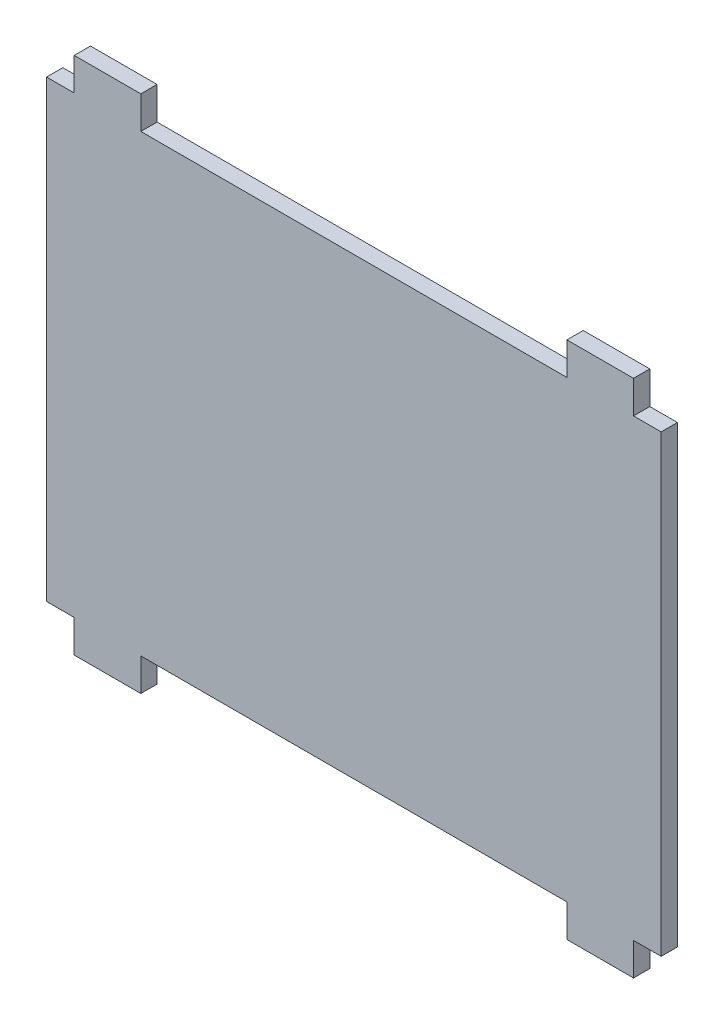
ISO-10303-21;
HEADER;
FILE_DESCRIPTION(('STEP AP214'),'2;1');
FILE_NAME('part.step','',(''),(''),'','','');
FILE_SCHEMA(('AUTOMOTIVE_DESIGN { 1 0 10303 214 1 1 1 1 }'));
ENDSEC;
DATA;
#1=APPLICATION_CONTEXT('core data for automotive mechanical design processes');
#2=APPLICATION_PROTOCOL_DEFINITION('international standard','automotive_design',2000,#1);
#3=PRODUCT_CONTEXT('',#1,'mechanical');
#4=PRODUCT('Part','Part','',(#3));
#5=PRODUCT_RELATED_PRODUCT_CATEGORY('part','',(#4));
#6=PRODUCT_DEFINITION_FORMATION('','',#4);
#7=PRODUCT_DEFINITION_CONTEXT('part definition',#1,'design');
#8=PRODUCT_DEFINITION('design','',#6,#7);
#9=PRODUCT_DEFINITION_SHAPE('','',#8);
#10=(LENGTH_UNIT() NAMED_UNIT(*) SI_UNIT(.MILLI.,.METRE.));
#11=(NAMED_UNIT(*) PLANE_ANGLE_UNIT() SI_UNIT($,.RADIAN.));
#12=(NAMED_UNIT(*) SI_UNIT($,.STERADIAN.) SOLID_ANGLE_UNIT());
#13=UNCERTAINTY_MEASURE_WITH_UNIT(LENGTH_MEASURE(1.E-05),#10,'distance_accuracy_value','');
#14=(GEOMETRIC_REPRESENTATION_CONTEXT(3) GLOBAL_UNCERTAINTY_ASSIGNED_CONTEXT((#13)) GLOBAL_UNIT_ASSIGNED_CONTEXT((#10,
#11,#12)) REPRESENTATION_CONTEXT('',''));
#15=CARTESIAN_POINT('',(0.,0.,0.));
#16=DIRECTION('',(0.,0.,1.));
#17=DIRECTION('',(1.,0.,0.));
#18=AXIS2_PLACEMENT_3D('',#15,#16,#17);
#19=CARTESIAN_POINT('',(-30.,0.,1.5875));
#20=DIRECTION('',(1.,0.,0.));
#21=DIRECTION('',(0.,0.,-1.));
#22=AXIS2_PLACEMENT_3D('',#19,#20,#21);
#23=PLANE('',#22);
#24=DIRECTION('',(0.,0.,-1.));
#25=VECTOR('',#24,1.);
#26=CARTESIAN_POINT('',(-30.,-22.17,1.5875));
#27=LINE('',#26,#25);
#28=CARTESIAN_POINT('',(-30.,-22.17,1.5875));
#29=VERTEX_POINT('',#28);
#30=CARTESIAN_POINT('',(-30.,-22.17,0.));
#31=VERTEX_POINT('',#30);
#32=EDGE_CURVE('E236',#29,#31,#27,.T.);
#33=ORIENTED_EDGE('',*,*,#32,.F.);
#34=DIRECTION('',(0.,-1.,0.));
#35=VECTOR('',#34,1.);
#36=CARTESIAN_POINT('',(-30.,0.,1.5875));
#37=LINE('',#36,#35);
#38=CARTESIAN_POINT('',(-30.,22.17,1.5875));
#39=VERTEX_POINT('',#38);
#40=EDGE_CURVE('E307',#39,#29,#37,.T.);
#41=ORIENTED_EDGE('',*,*,#40,.F.);
#42=DIRECTION('',(0.,0.,-1.));
#43=VECTOR('',#42,1.);
#44=CARTESIAN_POINT('',(-30.,22.17,1.5875));
#45=LINE('',#44,#43);
#46=CARTESIAN_POINT('',(-30.,22.17,0.));
#47=VERTEX_POINT('',#46);
#48=EDGE_CURVE('E303',#39,#47,#45,.T.);
#49=ORIENTED_EDGE('',*,*,#48,.T.);
#50=DIRECTION('',(0.,-1.,0.));
#51=VECTOR('',#50,1.);
#52=CARTESIAN_POINT('',(-30.,0.,0.));
#53=LINE('',#52,#51);
#54=EDGE_CURVE('E306',#47,#31,#53,.T.);
#55=ORIENTED_EDGE('',*,*,#54,.T.);
#56=EDGE_LOOP('',(#33,#41,#49,#55));
#57=FACE_BOUND('',#56,.T.);
#58=ADVANCED_FACE('F36',(#57),#23,.F.);
#59=CARTESIAN_POINT('',(30.,0.,1.5875));
#60=DIRECTION('',(-1.,0.,0.));
#61=DIRECTION('',(0.,0.,1.));
#62=AXIS2_PLACEMENT_3D('',#59,#60,#61);
#63=PLANE('',#62);
#64=DIRECTION('',(0.,0.,1.));
#65=VECTOR('',#64,1.);
#66=CARTESIAN_POINT('',(30.,-22.17,1.5875));
#67=LINE('',#66,#65);
#68=CARTESIAN_POINT('',(30.,-22.17,0.));
#69=VERTEX_POINT('',#68);
#70=CARTESIAN_POINT('',(30.,-22.17,1.5875));
#71=VERTEX_POINT('',#70);
#72=EDGE_CURVE('E229',#69,#71,#67,.T.);
#73=ORIENTED_EDGE('',*,*,#72,.F.);
#74=DIRECTION('',(0.,1.,0.));
#75=VECTOR('',#74,1.);
#76=CARTESIAN_POINT('',(30.,0.,0.));
#77=LINE('',#76,#75);
#78=CARTESIAN_POINT('',(30.,22.17,0.));
#79=VERTEX_POINT('',#78);
#80=EDGE_CURVE('E191',#69,#79,#77,.T.);
#81=ORIENTED_EDGE('',*,*,#80,.T.);
#82=DIRECTION('',(0.,0.,1.));
#83=VECTOR('',#82,1.);
#84=CARTESIAN_POINT('',(30.,22.17,1.5875));
#85=LINE('',#84,#83);
#86=CARTESIAN_POINT('',(30.,22.17,1.5875));
#87=VERTEX_POINT('',#86);
#88=EDGE_CURVE('E294',#79,#87,#85,.T.);
#89=ORIENTED_EDGE('',*,*,#88,.T.);
#90=DIRECTION('',(0.,1.,0.));
#91=VECTOR('',#90,1.);
#92=CARTESIAN_POINT('',(30.,0.,1.5875));
#93=LINE('',#92,#91);
#94=EDGE_CURVE('E310',#71,#87,#93,.T.);
#95=ORIENTED_EDGE('',*,*,#94,.F.);
#96=EDGE_LOOP('',(#73,#81,#89,#95));
#97=FACE_BOUND('',#96,.T.);
#98=ADVANCED_FACE('F349',(#97),#63,.F.);
#99=CARTESIAN_POINT('',(0.,0.,1.5875));
#100=DIRECTION('',(0.,0.,-1.));
#101=DIRECTION('',(-1.,0.,0.));
#102=AXIS2_PLACEMENT_3D('',#99,#100,#101);
#103=PLANE('',#102);
#104=DIRECTION('',(1.,0.,0.));
#105=VECTOR('',#104,1.);
#106=CARTESIAN_POINT('',(-32.7,-22.17,1.5875));
#107=LINE('',#106,#105);
#108=CARTESIAN_POINT('',(-27.3,-22.17,1.5875));
#109=VERTEX_POINT('',#108);
#110=EDGE_CURVE('E205',#29,#109,#107,.T.);
#111=ORIENTED_EDGE('',*,*,#110,.T.);
#112=DIRECTION('',(0.,-1.,0.));
#113=VECTOR('',#112,1.);
#114=CARTESIAN_POINT('',(-27.3,-25.35,1.5875));
#115=LINE('',#114,#113);
#116=CARTESIAN_POINT('',(-27.3,-25.35,1.5875));
#117=VERTEX_POINT('',#116);
#118=EDGE_CURVE('E202',#109,#117,#115,.T.);
#119=ORIENTED_EDGE('',*,*,#118,.T.);
#120=DIRECTION('',(-1.,0.,0.));
#121=VECTOR('',#120,1.);
#122=CARTESIAN_POINT('',(-30.,-25.35,1.5875));
#123=LINE('',#122,#121);
#124=CARTESIAN_POINT('',(-20.8,-25.35,1.5875));
#125=VERTEX_POINT('',#124);
#126=EDGE_CURVE('E239',#125,#117,#123,.T.);
#127=ORIENTED_EDGE('',*,*,#126,.F.);
#128=DIRECTION('',(0.,1.,0.));
#129=VECTOR('',#128,1.);
#130=CARTESIAN_POINT('',(-20.8,-25.35,1.5875));
#131=LINE('',#130,#129);
#132=CARTESIAN_POINT('',(-20.8,-22.17,1.5875));
#133=VERTEX_POINT('',#132);
#134=EDGE_CURVE('E50',#125,#133,#131,.T.);
#135=ORIENTED_EDGE('',*,*,#134,.T.);
#136=DIRECTION('',(1.,0.,0.));
#137=VECTOR('',#136,1.);
#138=CARTESIAN_POINT('',(-20.8,-22.17,1.5875));
#139=LINE('',#138,#137);
#140=CARTESIAN_POINT('',(20.8,-22.17,1.5875));
#141=VERTEX_POINT('',#140);
#142=EDGE_CURVE('E197',#133,#141,#139,.T.);
#143=ORIENTED_EDGE('',*,*,#142,.T.);
#144=DIRECTION('',(0.,-1.,0.));
#145=VECTOR('',#144,1.);
#146=CARTESIAN_POINT('',(20.8,-25.35,1.5875));
#147=LINE('',#146,#145);
#148=CARTESIAN_POINT('',(20.8,-25.35,1.5875));
#149=VERTEX_POINT('',#148);
#150=EDGE_CURVE('E216',#141,#149,#147,.T.);
#151=ORIENTED_EDGE('',*,*,#150,.T.);
#152=CARTESIAN_POINT('',(27.3,-25.35,1.5875));
#153=VERTEX_POINT('',#152);
#154=EDGE_CURVE('E242',#153,#149,#123,.T.);
#155=ORIENTED_EDGE('',*,*,#154,.F.);
#156=DIRECTION('',(0.,1.,0.));
#157=VECTOR('',#156,1.);
#158=CARTESIAN_POINT('',(27.3,-25.35,1.5875));
#159=LINE('',#158,#157);
#160=CARTESIAN_POINT('',(27.3,-22.17,1.5875));
#161=VERTEX_POINT('',#160);
#162=EDGE_CURVE('E58',#153,#161,#159,.T.);
#163=ORIENTED_EDGE('',*,*,#162,.T.);
#164=DIRECTION('',(1.,0.,0.));
#165=VECTOR('',#164,1.);
#166=CARTESIAN_POINT('',(27.3,-22.17,1.5875));
#167=LINE('',#166,#165);
#168=EDGE_CURVE('E185',#161,#71,#167,.T.);
#169=ORIENTED_EDGE('',*,*,#168,.T.);
#170=ORIENTED_EDGE('',*,*,#94,.T.);
#171=DIRECTION('',(1.,0.,0.));
#172=VECTOR('',#171,1.);
#173=CARTESIAN_POINT('',(27.3,22.17,1.5875));
#174=LINE('',#173,#172);
#175=CARTESIAN_POINT('',(27.3,22.17,1.5875));
#176=VERTEX_POINT('',#175);
#177=EDGE_CURVE('E253',#176,#87,#174,.T.);
#178=ORIENTED_EDGE('',*,*,#177,.F.);
#179=DIRECTION('',(0.,-1.,0.));
#180=VECTOR('',#179,1.);
#181=CARTESIAN_POINT('',(27.3,25.35,1.5875));
#182=LINE('',#181,#180);
#183=CARTESIAN_POINT('',(27.3,25.35,1.5875));
#184=VERTEX_POINT('',#183);
#185=EDGE_CURVE('E249',#184,#176,#182,.T.);
#186=ORIENTED_EDGE('',*,*,#185,.F.);
#187=DIRECTION('',(-1.,0.,0.));
#188=VECTOR('',#187,1.);
#189=CARTESIAN_POINT('',(-30.,25.35,1.5875));
#190=LINE('',#189,#188);
#191=CARTESIAN_POINT('',(20.8,25.35,1.5875));
#192=VERTEX_POINT('',#191);
#193=EDGE_CURVE('E43',#184,#192,#190,.T.);
#194=ORIENTED_EDGE('',*,*,#193,.T.);
#195=DIRECTION('',(0.,1.,0.));
#196=VECTOR('',#195,1.);
#197=CARTESIAN_POINT('',(20.8,25.35,1.5875));
#198=LINE('',#197,#196);
#199=CARTESIAN_POINT('',(20.8,22.17,1.5875));
#200=VERTEX_POINT('',#199);
#201=EDGE_CURVE('E288',#200,#192,#198,.T.);
#202=ORIENTED_EDGE('',*,*,#201,.F.);
#203=DIRECTION('',(1.,0.,0.));
#204=VECTOR('',#203,1.);
#205=CARTESIAN_POINT('',(-20.8,22.17,1.5875));
#206=LINE('',#205,#204);
#207=CARTESIAN_POINT('',(-20.8,22.17,1.5875));
#208=VERTEX_POINT('',#207);
#209=EDGE_CURVE('E261',#208,#200,#206,.T.);
#210=ORIENTED_EDGE('',*,*,#209,.F.);
#211=DIRECTION('',(0.,-1.,0.));
#212=VECTOR('',#211,1.);
#213=CARTESIAN_POINT('',(-20.8,25.35,1.5875));
#214=LINE('',#213,#212);
#215=CARTESIAN_POINT('',(-20.8,25.35,1.5875));
#216=VERTEX_POINT('',#215);
#217=EDGE_CURVE('E279',#216,#208,#214,.T.);
#218=ORIENTED_EDGE('',*,*,#217,.F.);
#219=CARTESIAN_POINT('',(-27.3,25.35,1.5875));
#220=VERTEX_POINT('',#219);
#221=EDGE_CURVE('E313',#216,#220,#190,.T.);
#222=ORIENTED_EDGE('',*,*,#221,.T.);
#223=DIRECTION('',(0.,1.,0.));
#224=VECTOR('',#223,1.);
#225=CARTESIAN_POINT('',(-27.3,25.35,1.5875));
#226=LINE('',#225,#224);
#227=CARTESIAN_POINT('',(-27.3,22.17,1.5875));
#228=VERTEX_POINT('',#227);
#229=EDGE_CURVE('E267',#228,#220,#226,.T.);
#230=ORIENTED_EDGE('',*,*,#229,.F.);
#231=DIRECTION('',(1.,0.,0.));
#232=VECTOR('',#231,1.);
#233=CARTESIAN_POINT('',(-32.7,22.17,1.5875));
#234=LINE('',#233,#232);
#235=EDGE_CURVE('E268',#39,#228,#234,.T.);
#236=ORIENTED_EDGE('',*,*,#235,.F.);
#237=ORIENTED_EDGE('',*,*,#40,.T.);
#238=EDGE_LOOP('',(#111,#119,#127,#135,#143,#151,#155,#163,#169,#170,#178,#186,#194,#202,#210,
#218,#222,#230,#236,#237));
#239=FACE_BOUND('',#238,.T.);
#240=ADVANCED_FACE('F337',(#239),#103,.F.);
#241=CARTESIAN_POINT('',(0.,0.,0.));
#242=DIRECTION('',(0.,0.,-1.));
#243=DIRECTION('',(-1.,0.,0.));
#244=AXIS2_PLACEMENT_3D('',#241,#242,#243);
#245=PLANE('',#244);
#246=DIRECTION('',(0.,-1.,0.));
#247=VECTOR('',#246,1.);
#248=CARTESIAN_POINT('',(-27.3,-25.35,0.));
#249=LINE('',#248,#247);
#250=CARTESIAN_POINT('',(-27.3,-22.17,0.));
#251=VERTEX_POINT('',#250);
#252=CARTESIAN_POINT('',(-27.3,-25.35,0.));
#253=VERTEX_POINT('',#252);
#254=EDGE_CURVE('E201',#251,#253,#249,.T.);
#255=ORIENTED_EDGE('',*,*,#254,.F.);
#256=DIRECTION('',(1.,0.,0.));
#257=VECTOR('',#256,1.);
#258=CARTESIAN_POINT('',(-32.7,-22.17,0.));
#259=LINE('',#258,#257);
#260=EDGE_CURVE('E199',#31,#251,#259,.T.);
#261=ORIENTED_EDGE('',*,*,#260,.F.);
#262=ORIENTED_EDGE('',*,*,#54,.F.);
#263=DIRECTION('',(-1.,0.,0.));
#264=VECTOR('',#263,1.);
#265=CARTESIAN_POINT('',(0.,22.17,0.));
#266=LINE('',#265,#264);
#267=CARTESIAN_POINT('',(-27.3,22.17,0.));
#268=VERTEX_POINT('',#267);
#269=EDGE_CURVE('E11',#268,#47,#266,.T.);
#270=ORIENTED_EDGE('',*,*,#269,.F.);
#271=DIRECTION('',(0.,1.,0.));
#272=VECTOR('',#271,1.);
#273=CARTESIAN_POINT('',(-27.3,25.35,0.));
#274=LINE('',#273,#272);
#275=CARTESIAN_POINT('',(-27.3,25.35,0.));
#276=VERTEX_POINT('',#275);
#277=EDGE_CURVE('E263',#268,#276,#274,.T.);
#278=ORIENTED_EDGE('',*,*,#277,.T.);
#279=DIRECTION('',(-1.,0.,0.));
#280=VECTOR('',#279,1.);
#281=CARTESIAN_POINT('',(-30.,25.35,0.));
#282=LINE('',#281,#280);
#283=CARTESIAN_POINT('',(-20.8,25.35,0.));
#284=VERTEX_POINT('',#283);
#285=EDGE_CURVE('E318',#284,#276,#282,.T.);
#286=ORIENTED_EDGE('',*,*,#285,.F.);
#287=DIRECTION('',(0.,-1.,0.));
#288=VECTOR('',#287,1.);
#289=CARTESIAN_POINT('',(-20.8,25.35,0.));
#290=LINE('',#289,#288);
#291=CARTESIAN_POINT('',(-20.8,22.17,0.));
#292=VERTEX_POINT('',#291);
#293=EDGE_CURVE('E282',#284,#292,#290,.T.);
#294=ORIENTED_EDGE('',*,*,#293,.T.);
#295=DIRECTION('',(1.,0.,0.));
#296=VECTOR('',#295,1.);
#297=CARTESIAN_POINT('',(-20.8,22.17,0.));
#298=LINE('',#297,#296);
#299=CARTESIAN_POINT('',(20.8,22.17,0.));
#300=VERTEX_POINT('',#299);
#301=EDGE_CURVE('E275',#292,#300,#298,.T.);
#302=ORIENTED_EDGE('',*,*,#301,.T.);
#303=DIRECTION('',(0.,1.,0.));
#304=VECTOR('',#303,1.);
#305=CARTESIAN_POINT('',(20.8,25.35,0.));
#306=LINE('',#305,#304);
#307=CARTESIAN_POINT('',(20.8,25.35,0.));
#308=VERTEX_POINT('',#307);
#309=EDGE_CURVE('E278',#300,#308,#306,.T.);
#310=ORIENTED_EDGE('',*,*,#309,.T.);
#311=CARTESIAN_POINT('',(27.3,25.35,0.));
#312=VERTEX_POINT('',#311);
#313=EDGE_CURVE('E311',#312,#308,#282,.T.);
#314=ORIENTED_EDGE('',*,*,#313,.F.);
#315=DIRECTION('',(0.,-1.,0.));
#316=VECTOR('',#315,1.);
#317=CARTESIAN_POINT('',(27.3,25.35,0.));
#318=LINE('',#317,#316);
#319=CARTESIAN_POINT('',(27.3,22.17,0.));
#320=VERTEX_POINT('',#319);
#321=EDGE_CURVE('E248',#312,#320,#318,.T.);
#322=ORIENTED_EDGE('',*,*,#321,.T.);
#323=DIRECTION('',(1.,0.,0.));
#324=VECTOR('',#323,1.);
#325=CARTESIAN_POINT('',(27.3,22.17,0.));
#326=LINE('',#325,#324);
#327=EDGE_CURVE('E246',#320,#79,#326,.T.);
#328=ORIENTED_EDGE('',*,*,#327,.T.);
#329=ORIENTED_EDGE('',*,*,#80,.F.);
#330=DIRECTION('',(1.,0.,0.));
#331=VECTOR('',#330,1.);
#332=CARTESIAN_POINT('',(27.3,-22.17,0.));
#333=LINE('',#332,#331);
#334=CARTESIAN_POINT('',(27.3,-22.17,0.));
#335=VERTEX_POINT('',#334);
#336=EDGE_CURVE('E179',#335,#69,#333,.T.);
#337=ORIENTED_EDGE('',*,*,#336,.F.);
#338=DIRECTION('',(0.,1.,0.));
#339=VECTOR('',#338,1.);
#340=CARTESIAN_POINT('',(27.3,-25.35,0.));
#341=LINE('',#340,#339);
#342=CARTESIAN_POINT('',(27.3,-25.35,0.));
#343=VERTEX_POINT('',#342);
#344=EDGE_CURVE('E169',#343,#335,#341,.T.);
#345=ORIENTED_EDGE('',*,*,#344,.F.);
#346=DIRECTION('',(-1.,0.,0.));
#347=VECTOR('',#346,1.);
#348=CARTESIAN_POINT('',(-30.,-25.35,0.));
#349=LINE('',#348,#347);
#350=CARTESIAN_POINT('',(20.8,-25.35,0.));
#351=VERTEX_POINT('',#350);
#352=EDGE_CURVE('E243',#343,#351,#349,.T.);
#353=ORIENTED_EDGE('',*,*,#352,.T.);
#354=DIRECTION('',(0.,-1.,0.));
#355=VECTOR('',#354,1.);
#356=CARTESIAN_POINT('',(20.8,-25.35,0.));
#357=LINE('',#356,#355);
#358=CARTESIAN_POINT('',(20.8,-22.17,0.));
#359=VERTEX_POINT('',#358);
#360=EDGE_CURVE('E218',#359,#351,#357,.T.);
#361=ORIENTED_EDGE('',*,*,#360,.F.);
#362=DIRECTION('',(1.,0.,0.));
#363=VECTOR('',#362,1.);
#364=CARTESIAN_POINT('',(-20.8,-22.17,0.));
#365=LINE('',#364,#363);
#366=CARTESIAN_POINT('',(-20.8,-22.17,0.));
#367=VERTEX_POINT('',#366);
#368=EDGE_CURVE('E213',#367,#359,#365,.T.);
#369=ORIENTED_EDGE('',*,*,#368,.F.);
#370=DIRECTION('',(0.,1.,0.));
#371=VECTOR('',#370,1.);
#372=CARTESIAN_POINT('',(-20.8,-25.35,0.));
#373=LINE('',#372,#371);
#374=CARTESIAN_POINT('',(-20.8,-25.35,0.));
#375=VERTEX_POINT('',#374);
#376=EDGE_CURVE('E215',#375,#367,#373,.T.);
#377=ORIENTED_EDGE('',*,*,#376,.F.);
#378=EDGE_CURVE('E238',#375,#253,#349,.T.);
#379=ORIENTED_EDGE('',*,*,#378,.T.);
#380=EDGE_LOOP('',(#255,#261,#262,#270,#278,#286,#294,#302,#310,#314,#322,#328,#329,#337,#345,
#353,#361,#369,#377,#379));
#381=FACE_BOUND('',#380,.T.);
#382=ADVANCED_FACE('F189',(#381),#245,.T.);
#383=CARTESIAN_POINT('',(-30.,-25.35,1.5875));
#384=DIRECTION('',(0.,-1.,0.));
#385=DIRECTION('',(0.,0.,-1.));
#386=AXIS2_PLACEMENT_3D('',#383,#384,#385);
#387=PLANE('',#386);
#388=ORIENTED_EDGE('',*,*,#126,.T.);
#389=DIRECTION('',(0.,0.,1.));
#390=VECTOR('',#389,1.);
#391=CARTESIAN_POINT('',(-27.3,-25.35,0.));
#392=LINE('',#391,#390);
#393=EDGE_CURVE('E204',#253,#117,#392,.T.);
#394=ORIENTED_EDGE('',*,*,#393,.F.);
#395=ORIENTED_EDGE('',*,*,#378,.F.);
#396=DIRECTION('',(0.,0.,1.));
#397=VECTOR('',#396,1.);
#398=CARTESIAN_POINT('',(-20.8,-25.35,0.));
#399=LINE('',#398,#397);
#400=EDGE_CURVE('E232',#375,#125,#399,.T.);
#401=ORIENTED_EDGE('',*,*,#400,.T.);
#402=EDGE_LOOP('',(#388,#394,#395,#401));
#403=FACE_BOUND('',#402,.T.);
#404=ADVANCED_FACE('F368',(#403),#387,.T.);
#405=ORIENTED_EDGE('',*,*,#352,.F.);
#406=DIRECTION('',(0.,0.,1.));
#407=VECTOR('',#406,1.);
#408=CARTESIAN_POINT('',(27.3,-25.35,0.));
#409=LINE('',#408,#407);
#410=EDGE_CURVE('E174',#343,#153,#409,.T.);
#411=ORIENTED_EDGE('',*,*,#410,.T.);
#412=ORIENTED_EDGE('',*,*,#154,.T.);
#413=DIRECTION('',(0.,0.,1.));
#414=VECTOR('',#413,1.);
#415=CARTESIAN_POINT('',(20.8,-25.35,0.));
#416=LINE('',#415,#414);
#417=EDGE_CURVE('E230',#351,#149,#416,.T.);
#418=ORIENTED_EDGE('',*,*,#417,.F.);
#419=EDGE_LOOP('',(#405,#411,#412,#418));
#420=FACE_BOUND('',#419,.T.);
#421=ADVANCED_FACE('F354',(#420),#387,.T.);
#422=CARTESIAN_POINT('',(-30.,25.35,1.5875));
#423=DIRECTION('',(0.,-1.,0.));
#424=DIRECTION('',(0.,0.,-1.));
#425=AXIS2_PLACEMENT_3D('',#422,#423,#424);
#426=PLANE('',#425);
#427=ORIENTED_EDGE('',*,*,#285,.T.);
#428=DIRECTION('',(0.,0.,1.));
#429=VECTOR('',#428,1.);
#430=CARTESIAN_POINT('',(-27.3,25.35,0.));
#431=LINE('',#430,#429);
#432=EDGE_CURVE('E256',#276,#220,#431,.T.);
#433=ORIENTED_EDGE('',*,*,#432,.T.);
#434=ORIENTED_EDGE('',*,*,#221,.F.);
#435=DIRECTION('',(0.,0.,1.));
#436=VECTOR('',#435,1.);
#437=CARTESIAN_POINT('',(-20.8,25.35,0.));
#438=LINE('',#437,#436);
#439=EDGE_CURVE('E295',#284,#216,#438,.T.);
#440=ORIENTED_EDGE('',*,*,#439,.F.);
#441=EDGE_LOOP('',(#427,#433,#434,#440));
#442=FACE_BOUND('',#441,.T.);
#443=ADVANCED_FACE('F390',(#442),#426,.F.);
#444=ORIENTED_EDGE('',*,*,#193,.F.);
#445=DIRECTION('',(0.,0.,1.));
#446=VECTOR('',#445,1.);
#447=CARTESIAN_POINT('',(27.3,25.35,0.));
#448=LINE('',#447,#446);
#449=EDGE_CURVE('E252',#312,#184,#448,.T.);
#450=ORIENTED_EDGE('',*,*,#449,.F.);
#451=ORIENTED_EDGE('',*,*,#313,.T.);
#452=DIRECTION('',(0.,0.,1.));
#453=VECTOR('',#452,1.);
#454=CARTESIAN_POINT('',(20.8,25.35,0.));
#455=LINE('',#454,#453);
#456=EDGE_CURVE('E297',#308,#192,#455,.T.);
#457=ORIENTED_EDGE('',*,*,#456,.T.);
#458=EDGE_LOOP('',(#444,#450,#451,#457));
#459=FACE_BOUND('',#458,.T.);
#460=ADVANCED_FACE('F328',(#459),#426,.F.);
#461=CARTESIAN_POINT('',(-20.8,22.17,0.));
#462=DIRECTION('',(0.,-1.,0.));
#463=DIRECTION('',(1.,0.,0.));
#464=AXIS2_PLACEMENT_3D('',#461,#462,#463);
#465=PLANE('',#464);
#466=ORIENTED_EDGE('',*,*,#209,.T.);
#467=DIRECTION('',(0.,0.,1.));
#468=VECTOR('',#467,1.);
#469=CARTESIAN_POINT('',(20.8,22.17,0.));
#470=LINE('',#469,#468);
#471=EDGE_CURVE('E285',#300,#200,#470,.T.);
#472=ORIENTED_EDGE('',*,*,#471,.F.);
#473=ORIENTED_EDGE('',*,*,#301,.F.);
#474=DIRECTION('',(0.,0.,1.));
#475=VECTOR('',#474,1.);
#476=CARTESIAN_POINT('',(-20.8,22.17,0.));
#477=LINE('',#476,#475);
#478=EDGE_CURVE('E292',#292,#208,#477,.T.);
#479=ORIENTED_EDGE('',*,*,#478,.T.);
#480=EDGE_LOOP('',(#466,#472,#473,#479));
#481=FACE_BOUND('',#480,.T.);
#482=ADVANCED_FACE('F394',(#481),#465,.F.);
#483=CARTESIAN_POINT('',(-20.8,25.35,0.));
#484=DIRECTION('',(-1.,0.,0.));
#485=DIRECTION('',(0.,0.,1.));
#486=AXIS2_PLACEMENT_3D('',#483,#484,#485);
#487=PLANE('',#486);
#488=ORIENTED_EDGE('',*,*,#217,.T.);
#489=ORIENTED_EDGE('',*,*,#478,.F.);
#490=ORIENTED_EDGE('',*,*,#293,.F.);
#491=ORIENTED_EDGE('',*,*,#439,.T.);
#492=EDGE_LOOP('',(#488,#489,#490,#491));
#493=FACE_BOUND('',#492,.T.);
#494=ADVANCED_FACE('F392',(#493),#487,.F.);
#495=CARTESIAN_POINT('',(20.8,25.35,0.));
#496=DIRECTION('',(1.,0.,0.));
#497=DIRECTION('',(0.,1.,0.));
#498=AXIS2_PLACEMENT_3D('',#495,#496,#497);
#499=PLANE('',#498);
#500=ORIENTED_EDGE('',*,*,#201,.T.);
#501=ORIENTED_EDGE('',*,*,#456,.F.);
#502=ORIENTED_EDGE('',*,*,#309,.F.);
#503=ORIENTED_EDGE('',*,*,#471,.T.);
#504=EDGE_LOOP('',(#500,#501,#502,#503));
#505=FACE_BOUND('',#504,.T.);
#506=ADVANCED_FACE('F333',(#505),#499,.F.);
#507=CARTESIAN_POINT('',(27.3,22.17,0.));
#508=DIRECTION('',(0.,-1.,0.));
#509=DIRECTION('',(0.,0.,-1.));
#510=AXIS2_PLACEMENT_3D('',#507,#508,#509);
#511=PLANE('',#510);
#512=ORIENTED_EDGE('',*,*,#327,.F.);
#513=DIRECTION('',(0.,0.,1.));
#514=VECTOR('',#513,1.);
#515=CARTESIAN_POINT('',(27.3,22.17,0.));
#516=LINE('',#515,#514);
#517=EDGE_CURVE('E259',#320,#176,#516,.T.);
#518=ORIENTED_EDGE('',*,*,#517,.T.);
#519=ORIENTED_EDGE('',*,*,#177,.T.);
#520=ORIENTED_EDGE('',*,*,#88,.F.);
#521=EDGE_LOOP('',(#512,#518,#519,#520));
#522=FACE_BOUND('',#521,.T.);
#523=ADVANCED_FACE('F345',(#522),#511,.F.);
#524=CARTESIAN_POINT('',(27.3,25.35,0.));
#525=DIRECTION('',(-1.,0.,0.));
#526=DIRECTION('',(0.,0.,1.));
#527=AXIS2_PLACEMENT_3D('',#524,#525,#526);
#528=PLANE('',#527);
#529=ORIENTED_EDGE('',*,*,#185,.T.);
#530=ORIENTED_EDGE('',*,*,#517,.F.);
#531=ORIENTED_EDGE('',*,*,#321,.F.);
#532=ORIENTED_EDGE('',*,*,#449,.T.);
#533=EDGE_LOOP('',(#529,#530,#531,#532));
#534=FACE_BOUND('',#533,.T.);
#535=ADVANCED_FACE('F343',(#534),#528,.F.);
#536=CARTESIAN_POINT('',(-32.7,22.17,0.));
#537=DIRECTION('',(0.,-1.,0.));
#538=DIRECTION('',(0.,0.,-1.));
#539=AXIS2_PLACEMENT_3D('',#536,#537,#538);
#540=PLANE('',#539);
#541=ORIENTED_EDGE('',*,*,#235,.T.);
#542=DIRECTION('',(0.,0.,1.));
#543=VECTOR('',#542,1.);
#544=CARTESIAN_POINT('',(-27.3,22.17,0.));
#545=LINE('',#544,#543);
#546=EDGE_CURVE('E266',#268,#228,#545,.T.);
#547=ORIENTED_EDGE('',*,*,#546,.F.);
#548=ORIENTED_EDGE('',*,*,#269,.T.);
#549=ORIENTED_EDGE('',*,*,#48,.F.);
#550=EDGE_LOOP('',(#541,#547,#548,#549));
#551=FACE_BOUND('',#550,.T.);
#552=ADVANCED_FACE('F386',(#551),#540,.F.);
#553=CARTESIAN_POINT('',(-27.3,25.35,0.));
#554=DIRECTION('',(1.,0.,0.));
#555=DIRECTION('',(0.,0.,-1.));
#556=AXIS2_PLACEMENT_3D('',#553,#554,#555);
#557=PLANE('',#556);
#558=ORIENTED_EDGE('',*,*,#229,.T.);
#559=ORIENTED_EDGE('',*,*,#432,.F.);
#560=ORIENTED_EDGE('',*,*,#277,.F.);
#561=ORIENTED_EDGE('',*,*,#546,.T.);
#562=EDGE_LOOP('',(#558,#559,#560,#561));
#563=FACE_BOUND('',#562,.T.);
#564=ADVANCED_FACE('F388',(#563),#557,.F.);
#565=CARTESIAN_POINT('',(-20.8,-22.17,0.));
#566=DIRECTION('',(0.,-1.,0.));
#567=DIRECTION('',(1.,0.,0.));
#568=AXIS2_PLACEMENT_3D('',#565,#566,#567);
#569=PLANE('',#568);
#570=ORIENTED_EDGE('',*,*,#142,.F.);
#571=DIRECTION('',(0.,0.,1.));
#572=VECTOR('',#571,1.);
#573=CARTESIAN_POINT('',(-20.8,-22.17,0.));
#574=LINE('',#573,#572);
#575=EDGE_CURVE('E220',#367,#133,#574,.T.);
#576=ORIENTED_EDGE('',*,*,#575,.F.);
#577=ORIENTED_EDGE('',*,*,#368,.T.);
#578=DIRECTION('',(0.,0.,1.));
#579=VECTOR('',#578,1.);
#580=CARTESIAN_POINT('',(20.8,-22.17,0.));
#581=LINE('',#580,#579);
#582=EDGE_CURVE('E226',#359,#141,#581,.T.);
#583=ORIENTED_EDGE('',*,*,#582,.T.);
#584=EDGE_LOOP('',(#570,#576,#577,#583));
#585=FACE_BOUND('',#584,.T.);
#586=ADVANCED_FACE('F363',(#585),#569,.T.);
#587=CARTESIAN_POINT('',(20.8,-25.35,0.));
#588=DIRECTION('',(-1.,0.,0.));
#589=DIRECTION('',(0.,-1.,0.));
#590=AXIS2_PLACEMENT_3D('',#587,#588,#589);
#591=PLANE('',#590);
#592=ORIENTED_EDGE('',*,*,#150,.F.);
#593=ORIENTED_EDGE('',*,*,#582,.F.);
#594=ORIENTED_EDGE('',*,*,#360,.T.);
#595=ORIENTED_EDGE('',*,*,#417,.T.);
#596=EDGE_LOOP('',(#592,#593,#594,#595));
#597=FACE_BOUND('',#596,.T.);
#598=ADVANCED_FACE('F360',(#597),#591,.T.);
#599=CARTESIAN_POINT('',(-20.8,-25.35,0.));
#600=DIRECTION('',(1.,0.,0.));
#601=DIRECTION('',(0.,0.,-1.));
#602=AXIS2_PLACEMENT_3D('',#599,#600,#601);
#603=PLANE('',#602);
#604=ORIENTED_EDGE('',*,*,#134,.F.);
#605=ORIENTED_EDGE('',*,*,#400,.F.);
#606=ORIENTED_EDGE('',*,*,#376,.T.);
#607=ORIENTED_EDGE('',*,*,#575,.T.);
#608=EDGE_LOOP('',(#604,#605,#606,#607));
#609=FACE_BOUND('',#608,.T.);
#610=ADVANCED_FACE('F370',(#609),#603,.T.);
#611=CARTESIAN_POINT('',(27.3,-22.17,0.));
#612=DIRECTION('',(0.,-1.,0.));
#613=DIRECTION('',(0.,0.,-1.));
#614=AXIS2_PLACEMENT_3D('',#611,#612,#613);
#615=PLANE('',#614);
#616=ORIENTED_EDGE('',*,*,#72,.T.);
#617=ORIENTED_EDGE('',*,*,#168,.F.);
#618=DIRECTION('',(0.,0.,1.));
#619=VECTOR('',#618,1.);
#620=CARTESIAN_POINT('',(27.3,-22.17,0.));
#621=LINE('',#620,#619);
#622=EDGE_CURVE('E172',#335,#161,#621,.T.);
#623=ORIENTED_EDGE('',*,*,#622,.F.);
#624=ORIENTED_EDGE('',*,*,#336,.T.);
#625=EDGE_LOOP('',(#616,#617,#623,#624));
#626=FACE_BOUND('',#625,.T.);
#627=ADVANCED_FACE('F182',(#626),#615,.T.);
#628=CARTESIAN_POINT('',(27.3,-25.35,0.));
#629=DIRECTION('',(1.,0.,0.));
#630=DIRECTION('',(0.,0.,-1.));
#631=AXIS2_PLACEMENT_3D('',#628,#629,#630);
#632=PLANE('',#631);
#633=ORIENTED_EDGE('',*,*,#162,.F.);
#634=ORIENTED_EDGE('',*,*,#410,.F.);
#635=ORIENTED_EDGE('',*,*,#344,.T.);
#636=ORIENTED_EDGE('',*,*,#622,.T.);
#637=EDGE_LOOP('',(#633,#634,#635,#636));
#638=FACE_BOUND('',#637,.T.);
#639=ADVANCED_FACE('F171',(#638),#632,.T.);
#640=CARTESIAN_POINT('',(-32.7,-22.17,0.));
#641=DIRECTION('',(0.,-1.,0.));
#642=DIRECTION('',(0.,0.,-1.));
#643=AXIS2_PLACEMENT_3D('',#640,#641,#642);
#644=PLANE('',#643);
#645=ORIENTED_EDGE('',*,*,#32,.T.);
#646=ORIENTED_EDGE('',*,*,#260,.T.);
#647=DIRECTION('',(0.,0.,1.));
#648=VECTOR('',#647,1.);
#649=CARTESIAN_POINT('',(-27.3,-22.17,0.));
#650=LINE('',#649,#648);
#651=EDGE_CURVE('E195',#251,#109,#650,.T.);
#652=ORIENTED_EDGE('',*,*,#651,.T.);
#653=ORIENTED_EDGE('',*,*,#110,.F.);
#654=EDGE_LOOP('',(#645,#646,#652,#653));
#655=FACE_BOUND('',#654,.T.);
#656=ADVANCED_FACE('F377',(#655),#644,.T.);
#657=CARTESIAN_POINT('',(-27.3,-25.35,0.));
#658=DIRECTION('',(-1.,0.,0.));
#659=DIRECTION('',(0.,0.,1.));
#660=AXIS2_PLACEMENT_3D('',#657,#658,#659);
#661=PLANE('',#660);
#662=ORIENTED_EDGE('',*,*,#118,.F.);
#663=ORIENTED_EDGE('',*,*,#651,.F.);
#664=ORIENTED_EDGE('',*,*,#254,.T.);
#665=ORIENTED_EDGE('',*,*,#393,.T.);
#666=EDGE_LOOP('',(#662,#663,#664,#665));
#667=FACE_BOUND('',#666,.T.);
#668=ADVANCED_FACE('F375',(#667),#661,.T.);
#669=CLOSED_SHELL('',(#58,#98,#240,#382,#404,#421,#443,#460,#482,#494,#506,#523,#535,#552,#564,
#586,#598,#610,#627,#639,#656,#668));
#670=MANIFOLD_SOLID_BREP('B2',#669);
#671=ADVANCED_BREP_SHAPE_REPRESENTATION('',(#18,#670),#14);
#672=SHAPE_DEFINITION_REPRESENTATION(#9,#671);
ENDSEC;
END-ISO-10303-21;
